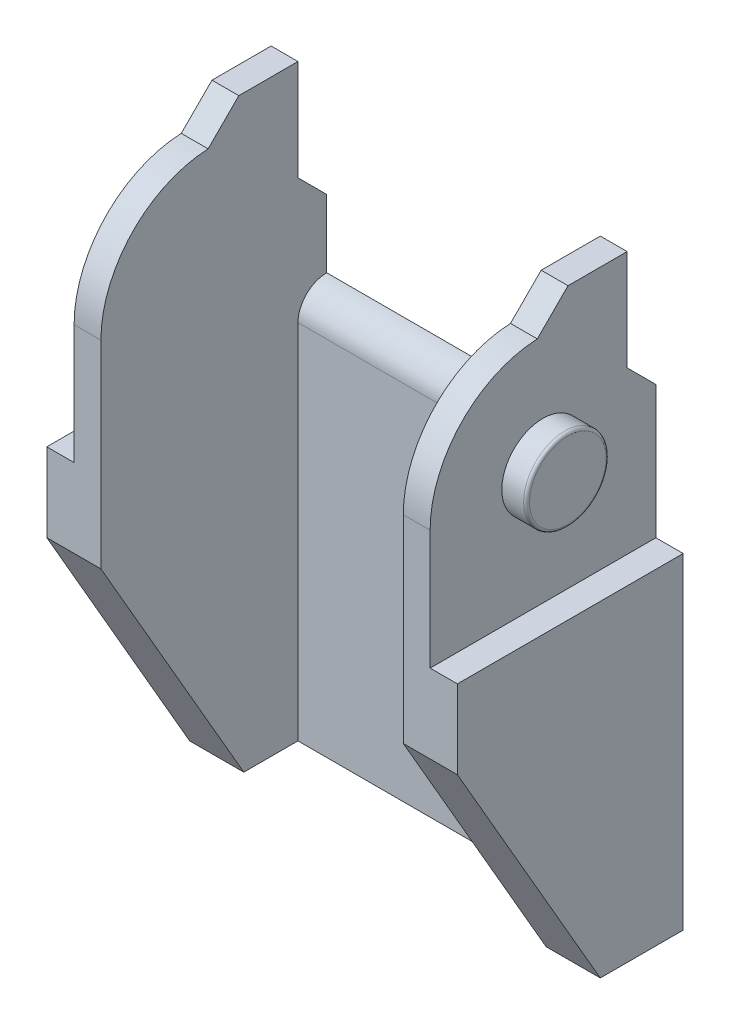
ISO-10303-21;
HEADER;
FILE_DESCRIPTION(('STEP AP214'),'2;1');
FILE_NAME('part.step','',(''),(''),'','','');
FILE_SCHEMA(('AUTOMOTIVE_DESIGN { 1 0 10303 214 1 1 1 1 }'));
ENDSEC;
DATA;
#1=APPLICATION_CONTEXT('core data for automotive mechanical design processes');
#2=APPLICATION_PROTOCOL_DEFINITION('international standard','automotive_design',2000,#1);
#3=PRODUCT_CONTEXT('',#1,'mechanical');
#4=PRODUCT('Part','Part','',(#3));
#5=PRODUCT_RELATED_PRODUCT_CATEGORY('part','',(#4));
#6=PRODUCT_DEFINITION_FORMATION('','',#4);
#7=PRODUCT_DEFINITION_CONTEXT('part definition',#1,'design');
#8=PRODUCT_DEFINITION('design','',#6,#7);
#9=PRODUCT_DEFINITION_SHAPE('','',#8);
#10=(LENGTH_UNIT() NAMED_UNIT(*) SI_UNIT(.MILLI.,.METRE.));
#11=(NAMED_UNIT(*) PLANE_ANGLE_UNIT() SI_UNIT($,.RADIAN.));
#12=(NAMED_UNIT(*) SI_UNIT($,.STERADIAN.) SOLID_ANGLE_UNIT());
#13=UNCERTAINTY_MEASURE_WITH_UNIT(LENGTH_MEASURE(1.E-05),#10,'distance_accuracy_value','');
#14=(GEOMETRIC_REPRESENTATION_CONTEXT(3) GLOBAL_UNCERTAINTY_ASSIGNED_CONTEXT((#13)) GLOBAL_UNIT_ASSIGNED_CONTEXT((#10,
#11,#12)) REPRESENTATION_CONTEXT('',''));
#15=CARTESIAN_POINT('',(0.,0.,0.));
#16=DIRECTION('',(0.,0.,1.));
#17=DIRECTION('',(1.,0.,0.));
#18=AXIS2_PLACEMENT_3D('',#15,#16,#17);
#19=CARTESIAN_POINT('',(10.25,2.1675,15.31));
#20=DIRECTION('',(0.,0.,-1.));
#21=DIRECTION('',(-1.,0.,0.));
#22=AXIS2_PLACEMENT_3D('',#19,#20,#21);
#23=PLANE('',#22);
#24=DIRECTION('',(-1.,0.,0.));
#25=VECTOR('',#24,1.);
#26=CARTESIAN_POINT('',(13.92,10.2629827702435,15.3100000000817));
#27=LINE('',#26,#25);
#28=CARTESIAN_POINT('',(12.07,10.2629827702435,15.3100000000817));
#29=VERTEX_POINT('',#28);
#30=CARTESIAN_POINT('',(10.25,10.2629827702435,15.3100000000817));
#31=VERTEX_POINT('',#30);
#32=EDGE_CURVE('E241',#29,#31,#27,.T.);
#33=ORIENTED_EDGE('',*,*,#32,.T.);
#34=DIRECTION('',(0.,-1.,0.));
#35=VECTOR('',#34,1.);
#36=CARTESIAN_POINT('',(10.25,10.2629827701714,15.31));
#37=LINE('',#36,#35);
#38=CARTESIAN_POINT('',(10.25,-3.1675,15.31));
#39=VERTEX_POINT('',#38);
#40=EDGE_CURVE('E316',#31,#39,#37,.T.);
#41=ORIENTED_EDGE('',*,*,#40,.T.);
#42=DIRECTION('',(-1.,0.,0.));
#43=VECTOR('',#42,1.);
#44=CARTESIAN_POINT('',(10.25,-3.1675,15.31));
#45=LINE('',#44,#43);
#46=CARTESIAN_POINT('',(13.92,-3.1675,15.31));
#47=VERTEX_POINT('',#46);
#48=EDGE_CURVE('E367',#47,#39,#45,.T.);
#49=ORIENTED_EDGE('',*,*,#48,.F.);
#50=DIRECTION('',(0.,-1.,0.));
#51=VECTOR('',#50,1.);
#52=CARTESIAN_POINT('',(13.92,2.1675,15.31));
#53=LINE('',#52,#51);
#54=CARTESIAN_POINT('',(13.92,2.1675,15.31));
#55=VERTEX_POINT('',#54);
#56=EDGE_CURVE('E353',#55,#47,#53,.T.);
#57=ORIENTED_EDGE('',*,*,#56,.F.);
#58=DIRECTION('',(1.,0.,0.));
#59=VECTOR('',#58,1.);
#60=CARTESIAN_POINT('',(12.07,2.1675,15.31));
#61=LINE('',#60,#59);
#62=CARTESIAN_POINT('',(12.07,2.1675,15.31));
#63=VERTEX_POINT('',#62);
#64=EDGE_CURVE('E268',#63,#55,#61,.T.);
#65=ORIENTED_EDGE('',*,*,#64,.F.);
#66=DIRECTION('',(0.,-1.,0.));
#67=VECTOR('',#66,1.);
#68=CARTESIAN_POINT('',(12.07,10.2629827701714,15.31));
#69=LINE('',#68,#67);
#70=EDGE_CURVE('E258',#29,#63,#69,.T.);
#71=ORIENTED_EDGE('',*,*,#70,.F.);
#72=EDGE_LOOP('',(#33,#41,#49,#57,#65,#71));
#73=FACE_BOUND('',#72,.T.);
#74=ADVANCED_FACE('F49',(#73),#23,.F.);
#75=CARTESIAN_POINT('',(10.25,-19.9474726521634,5.6220782759702));
#76=DIRECTION('',(0.,-0.499999999857117,0.866025403866932));
#77=DIRECTION('',(0.,-0.866025403866932,-0.499999999857117));
#78=AXIS2_PLACEMENT_3D('',#75,#76,#77);
#79=PLANE('',#78);
#80=DIRECTION('',(1.,0.,0.));
#81=VECTOR('',#80,1.);
#82=CARTESIAN_POINT('',(-13.92,-19.9475,5.62206248299805));
#83=LINE('',#82,#81);
#84=CARTESIAN_POINT('',(-13.92,-19.9475,5.62206248299805));
#85=VERTEX_POINT('',#84);
#86=CARTESIAN_POINT('',(-10.25,-19.9475,5.62206248484372));
#87=VERTEX_POINT('',#86);
#88=EDGE_CURVE('E350',#85,#87,#83,.T.);
#89=ORIENTED_EDGE('',*,*,#88,.T.);
#90=DIRECTION('',(0.,-0.866025403784439,-0.5));
#91=VECTOR('',#90,1.);
#92=CARTESIAN_POINT('',(-10.25,-3.1675,15.31));
#93=LINE('',#92,#91);
#94=CARTESIAN_POINT('',(-10.25,-3.1675,15.31));
#95=VERTEX_POINT('',#94);
#96=EDGE_CURVE('E322',#95,#87,#93,.T.);
#97=ORIENTED_EDGE('',*,*,#96,.F.);
#98=CARTESIAN_POINT('',(-13.92,-3.1675,15.31));
#99=VERTEX_POINT('',#98);
#100=EDGE_CURVE('E373',#95,#99,#45,.T.);
#101=ORIENTED_EDGE('',*,*,#100,.T.);
#102=DIRECTION('',(0.,0.866025403784438,0.500000000000001));
#103=VECTOR('',#102,1.);
#104=CARTESIAN_POINT('',(-13.92,-3.1675,15.31));
#105=LINE('',#104,#103);
#106=EDGE_CURVE('E347',#85,#99,#105,.T.);
#107=ORIENTED_EDGE('',*,*,#106,.F.);
#108=EDGE_LOOP('',(#89,#97,#101,#107));
#109=FACE_BOUND('',#108,.T.);
#110=ADVANCED_FACE('F939',(#109),#79,.T.);
#111=DIRECTION('',(0.,-1.,0.));
#112=VECTOR('',#111,1.);
#113=CARTESIAN_POINT('',(-10.25,19.9475,15.31));
#114=LINE('',#113,#112);
#115=CARTESIAN_POINT('',(-10.25,10.2629827701654,15.31));
#116=VERTEX_POINT('',#115);
#117=EDGE_CURVE('E319',#116,#95,#114,.T.);
#118=ORIENTED_EDGE('',*,*,#117,.F.);
#119=DIRECTION('',(1.,0.,0.));
#120=VECTOR('',#119,1.);
#121=CARTESIAN_POINT('',(-13.92,10.2629827701654,15.31));
#122=LINE('',#121,#120);
#123=CARTESIAN_POINT('',(-12.07,10.2629827701654,15.31));
#124=VERTEX_POINT('',#123);
#125=EDGE_CURVE('E289',#124,#116,#122,.T.);
#126=ORIENTED_EDGE('',*,*,#125,.F.);
#127=DIRECTION('',(0.,-1.,0.));
#128=VECTOR('',#127,1.);
#129=CARTESIAN_POINT('',(-12.07,19.9475,15.31));
#130=LINE('',#129,#128);
#131=CARTESIAN_POINT('',(-12.07,2.1675,15.31));
#132=VERTEX_POINT('',#131);
#133=EDGE_CURVE('E296',#124,#132,#130,.T.);
#134=ORIENTED_EDGE('',*,*,#133,.T.);
#135=DIRECTION('',(-1.,0.,0.));
#136=VECTOR('',#135,1.);
#137=CARTESIAN_POINT('',(-12.07,2.1675,15.31));
#138=LINE('',#137,#136);
#139=CARTESIAN_POINT('',(-13.92,2.1675,15.31));
#140=VERTEX_POINT('',#139);
#141=EDGE_CURVE('E298',#132,#140,#138,.T.);
#142=ORIENTED_EDGE('',*,*,#141,.T.);
#143=DIRECTION('',(0.,1.,0.));
#144=VECTOR('',#143,1.);
#145=CARTESIAN_POINT('',(-13.92,2.1675,15.31));
#146=LINE('',#145,#144);
#147=EDGE_CURVE('E339',#99,#140,#146,.T.);
#148=ORIENTED_EDGE('',*,*,#147,.F.);
#149=ORIENTED_EDGE('',*,*,#100,.F.);
#150=EDGE_LOOP('',(#118,#126,#134,#142,#148,#149));
#151=FACE_BOUND('',#150,.T.);
#152=ADVANCED_FACE('F930',(#151),#23,.F.);
#153=CARTESIAN_POINT('',(0.,19.9475,0.));
#154=DIRECTION('',(0.,-1.,0.));
#155=DIRECTION('',(0.,0.,-1.));
#156=AXIS2_PLACEMENT_3D('',#153,#154,#155);
#157=PLANE('',#156);
#158=DIRECTION('',(0.,0.,1.));
#159=VECTOR('',#158,1.);
#160=CARTESIAN_POINT('',(-10.25,19.9475,5.95980410209104));
#161=LINE('',#160,#159);
#162=CARTESIAN_POINT('',(-10.25,19.9475,1.95));
#163=VERTEX_POINT('',#162);
#164=CARTESIAN_POINT('',(-10.25,19.9474999999203,5.95980410201135));
#165=VERTEX_POINT('',#164);
#166=EDGE_CURVE('E317',#163,#165,#161,.T.);
#167=ORIENTED_EDGE('',*,*,#166,.F.);
#168=DIRECTION('',(1.,0.,0.));
#169=VECTOR('',#168,1.);
#170=CARTESIAN_POINT('',(-13.92,19.9475,1.95));
#171=LINE('',#170,#169);
#172=CARTESIAN_POINT('',(-12.07,19.9475,1.95));
#173=VERTEX_POINT('',#172);
#174=EDGE_CURVE('E223',#173,#163,#171,.T.);
#175=ORIENTED_EDGE('',*,*,#174,.F.);
#176=DIRECTION('',(0.,0.,-1.));
#177=VECTOR('',#176,1.);
#178=CARTESIAN_POINT('',(-12.07,19.9475,15.31));
#179=LINE('',#178,#177);
#180=CARTESIAN_POINT('',(-12.07,19.9475,5.95980410193166));
#181=VERTEX_POINT('',#180);
#182=EDGE_CURVE('E302',#181,#173,#179,.T.);
#183=ORIENTED_EDGE('',*,*,#182,.F.);
#184=DIRECTION('',(1.,0.,0.));
#185=VECTOR('',#184,1.);
#186=CARTESIAN_POINT('',(-13.92,19.9474999999203,5.95980410201135));
#187=LINE('',#186,#185);
#188=EDGE_CURVE('E292',#181,#165,#187,.T.);
#189=ORIENTED_EDGE('',*,*,#188,.T.);
#190=EDGE_LOOP('',(#167,#175,#183,#189));
#191=FACE_BOUND('',#190,.T.);
#192=ADVANCED_FACE('F914',(#191),#157,.F.);
#193=CARTESIAN_POINT('',(0.,0.,0.));
#194=DIRECTION('',(0.,0.,1.));
#195=DIRECTION('',(1.,0.,0.));
#196=AXIS2_PLACEMENT_3D('',#193,#194,#195);
#197=PLANE('',#196);
#198=CARTESIAN_POINT('',(0.,-12.9475,0.));
#199=DIRECTION('',(0.,0.,-1.));
#200=DIRECTION('',(-1.,0.,0.));
#201=AXIS2_PLACEMENT_3D('',#198,#199,#200);
#202=CIRCLE('',#201,1.7);
#203=CARTESIAN_POINT('',(-1.7,-12.9475,0.));
#204=VERTEX_POINT('',#203);
#205=EDGE_CURVE('E895',#204,#204,#202,.T.);
#206=ORIENTED_EDGE('',*,*,#205,.F.);
#207=EDGE_LOOP('',(#206));
#208=FACE_BOUND('',#207,.T.);
#209=CARTESIAN_POINT('',(0.,-3.9475,0.));
#210=DIRECTION('',(0.,0.,-1.));
#211=DIRECTION('',(-1.,0.,0.));
#212=AXIS2_PLACEMENT_3D('',#209,#210,#211);
#213=CIRCLE('',#212,1.7);
#214=CARTESIAN_POINT('',(-1.7,-3.9475,0.));
#215=VERTEX_POINT('',#214);
#216=EDGE_CURVE('E900',#215,#215,#213,.T.);
#217=ORIENTED_EDGE('',*,*,#216,.F.);
#218=EDGE_LOOP('',(#217));
#219=FACE_BOUND('',#218,.T.);
#220=DIRECTION('',(0.,-1.,0.));
#221=VECTOR('',#220,1.);
#222=CARTESIAN_POINT('',(-12.07,11.1675,0.));
#223=LINE('',#222,#221);
#224=CARTESIAN_POINT('',(-12.07,11.1675,0.));
#225=VERTEX_POINT('',#224);
#226=CARTESIAN_POINT('',(-12.07,2.1675,0.));
#227=VERTEX_POINT('',#226);
#228=EDGE_CURVE('E291',#225,#227,#223,.T.);
#229=ORIENTED_EDGE('',*,*,#228,.F.);
#230=DIRECTION('',(1.,0.,0.));
#231=VECTOR('',#230,1.);
#232=CARTESIAN_POINT('',(-13.92,11.1675,0.));
#233=LINE('',#232,#231);
#234=CARTESIAN_POINT('',(-10.25,11.1675,0.));
#235=VERTEX_POINT('',#234);
#236=EDGE_CURVE('E66',#225,#235,#233,.T.);
#237=ORIENTED_EDGE('',*,*,#236,.T.);
#238=DIRECTION('',(0.,1.,0.));
#239=VECTOR('',#238,1.);
#240=CARTESIAN_POINT('',(-10.25,6.56727770770958,-2.16703878204331E-08));
#241=LINE('',#240,#239);
#242=CARTESIAN_POINT('',(-10.25,6.56727770770958,-2.16703879398362E-08));
#243=VERTEX_POINT('',#242);
#244=EDGE_CURVE('E231',#243,#235,#241,.T.);
#245=ORIENTED_EDGE('',*,*,#244,.F.);
#246=DIRECTION('',(1.,0.,0.));
#247=VECTOR('',#246,1.);
#248=CARTESIAN_POINT('',(-10.25,6.56727770770958,-2.16703879398362E-08));
#249=LINE('',#248,#247);
#250=CARTESIAN_POINT('',(10.25,6.56727770770958,-2.16703879398362E-08));
#251=VERTEX_POINT('',#250);
#252=EDGE_CURVE('E336',#243,#251,#249,.T.);
#253=ORIENTED_EDGE('',*,*,#252,.T.);
#254=DIRECTION('',(0.,1.,0.));
#255=VECTOR('',#254,1.);
#256=CARTESIAN_POINT('',(10.25,11.1672777077096,-2.16703878204331E-08));
#257=LINE('',#256,#255);
#258=CARTESIAN_POINT('',(10.25,11.1675,0.));
#259=VERTEX_POINT('',#258);
#260=EDGE_CURVE('E320',#251,#259,#257,.T.);
#261=ORIENTED_EDGE('',*,*,#260,.T.);
#262=DIRECTION('',(1.,0.,0.));
#263=VECTOR('',#262,1.);
#264=CARTESIAN_POINT('',(-13.921,11.1675,0.));
#265=LINE('',#264,#263);
#266=CARTESIAN_POINT('',(12.07,11.1675,0.));
#267=VERTEX_POINT('',#266);
#268=EDGE_CURVE('E256',#259,#267,#265,.T.);
#269=ORIENTED_EDGE('',*,*,#268,.T.);
#270=DIRECTION('',(0.,-1.,0.));
#271=VECTOR('',#270,1.);
#272=CARTESIAN_POINT('',(12.07,19.9475,-2.16703877065072E-08));
#273=LINE('',#272,#271);
#274=CARTESIAN_POINT('',(12.07,2.1675,-2.16703877065072E-08));
#275=VERTEX_POINT('',#274);
#276=EDGE_CURVE('E265',#267,#275,#273,.T.);
#277=ORIENTED_EDGE('',*,*,#276,.T.);
#278=DIRECTION('',(1.,0.,0.));
#279=VECTOR('',#278,1.);
#280=CARTESIAN_POINT('',(12.07,2.1675,-2.16703877065072E-08));
#281=LINE('',#280,#279);
#282=CARTESIAN_POINT('',(13.92,2.1675,-2.16703877065072E-08));
#283=VERTEX_POINT('',#282);
#284=EDGE_CURVE('E267',#275,#283,#281,.T.);
#285=ORIENTED_EDGE('',*,*,#284,.T.);
#286=DIRECTION('',(0.,1.,0.));
#287=VECTOR('',#286,1.);
#288=CARTESIAN_POINT('',(13.92,2.1675,0.));
#289=LINE('',#288,#287);
#290=CARTESIAN_POINT('',(13.92,-19.9475,0.));
#291=VERTEX_POINT('',#290);
#292=EDGE_CURVE('E360',#291,#283,#289,.T.);
#293=ORIENTED_EDGE('',*,*,#292,.F.);
#294=DIRECTION('',(-1.,0.,0.));
#295=VECTOR('',#294,1.);
#296=CARTESIAN_POINT('',(-10.25,-19.9475,0.));
#297=LINE('',#296,#295);
#298=CARTESIAN_POINT('',(-13.92,-19.9475,0.));
#299=VERTEX_POINT('',#298);
#300=EDGE_CURVE('E366',#291,#299,#297,.T.);
#301=ORIENTED_EDGE('',*,*,#300,.T.);
#302=DIRECTION('',(0.,-1.,0.));
#303=VECTOR('',#302,1.);
#304=CARTESIAN_POINT('',(-13.92,2.1675,0.));
#305=LINE('',#304,#303);
#306=CARTESIAN_POINT('',(-13.92,2.1675,0.));
#307=VERTEX_POINT('',#306);
#308=EDGE_CURVE('E343',#307,#299,#305,.T.);
#309=ORIENTED_EDGE('',*,*,#308,.F.);
#310=DIRECTION('',(-1.,0.,0.));
#311=VECTOR('',#310,1.);
#312=CARTESIAN_POINT('',(-12.07,2.1675,0.));
#313=LINE('',#312,#311);
#314=EDGE_CURVE('E299',#227,#307,#313,.T.);
#315=ORIENTED_EDGE('',*,*,#314,.F.);
#316=EDGE_LOOP('',(#229,#237,#245,#253,#261,#269,#277,#285,#293,#301,#309,#315));
#317=FACE_BOUND('',#316,.T.);
#318=ADVANCED_FACE('F910',(#208,#219,#317),#197,.F.);
#319=DIRECTION('',(0.,-0.866025403784439,-0.5));
#320=VECTOR('',#319,1.);
#321=CARTESIAN_POINT('',(10.25,-3.1675,15.31));
#322=LINE('',#321,#320);
#323=CARTESIAN_POINT('',(10.25,-19.9475,5.62206248484372));
#324=VERTEX_POINT('',#323);
#325=EDGE_CURVE('E329',#39,#324,#322,.T.);
#326=ORIENTED_EDGE('',*,*,#325,.T.);
#327=DIRECTION('',(-1.,0.,0.));
#328=VECTOR('',#327,1.);
#329=CARTESIAN_POINT('',(13.92,-19.9475,5.62206248299805));
#330=LINE('',#329,#328);
#331=CARTESIAN_POINT('',(13.92,-19.9475,5.62206248299805));
#332=VERTEX_POINT('',#331);
#333=EDGE_CURVE('E363',#332,#324,#330,.T.);
#334=ORIENTED_EDGE('',*,*,#333,.F.);
#335=DIRECTION('',(0.,-0.866025403784438,-0.500000000000001));
#336=VECTOR('',#335,1.);
#337=CARTESIAN_POINT('',(13.92,-19.9475,5.62206248299805));
#338=LINE('',#337,#336);
#339=EDGE_CURVE('E355',#47,#332,#338,.T.);
#340=ORIENTED_EDGE('',*,*,#339,.F.);
#341=ORIENTED_EDGE('',*,*,#48,.T.);
#342=EDGE_LOOP('',(#326,#334,#340,#341));
#343=FACE_BOUND('',#342,.T.);
#344=ADVANCED_FACE('F913',(#343),#79,.T.);
#345=CARTESIAN_POINT('',(-10.25,-19.9475,0.));
#346=DIRECTION('',(0.,1.,0.));
#347=DIRECTION('',(0.,0.,1.));
#348=AXIS2_PLACEMENT_3D('',#345,#346,#347);
#349=PLANE('',#348);
#350=DIRECTION('',(1.,0.,0.));
#351=VECTOR('',#350,1.);
#352=CARTESIAN_POINT('',(-10.25,-19.9475,1.94999997832964));
#353=LINE('',#352,#351);
#354=CARTESIAN_POINT('',(-10.25,-19.9475,1.94999997832964));
#355=VERTEX_POINT('',#354);
#356=CARTESIAN_POINT('',(10.25,-19.9475,1.94999997832964));
#357=VERTEX_POINT('',#356);
#358=EDGE_CURVE('E372',#355,#357,#353,.T.);
#359=ORIENTED_EDGE('',*,*,#358,.F.);
#360=DIRECTION('',(0.,0.,-1.));
#361=VECTOR('',#360,1.);
#362=CARTESIAN_POINT('',(-10.25,-19.9475,0.));
#363=LINE('',#362,#361);
#364=EDGE_CURVE('E859',#87,#355,#363,.T.);
#365=ORIENTED_EDGE('',*,*,#364,.F.);
#366=ORIENTED_EDGE('',*,*,#88,.F.);
#367=DIRECTION('',(0.,0.,1.));
#368=VECTOR('',#367,1.);
#369=CARTESIAN_POINT('',(-13.92,-19.9475,5.62206248299805));
#370=LINE('',#369,#368);
#371=EDGE_CURVE('E345',#299,#85,#370,.T.);
#372=ORIENTED_EDGE('',*,*,#371,.F.);
#373=ORIENTED_EDGE('',*,*,#300,.F.);
#374=DIRECTION('',(0.,0.,-1.));
#375=VECTOR('',#374,1.);
#376=CARTESIAN_POINT('',(13.92,-19.9475,0.));
#377=LINE('',#376,#375);
#378=EDGE_CURVE('E357',#332,#291,#377,.T.);
#379=ORIENTED_EDGE('',*,*,#378,.F.);
#380=ORIENTED_EDGE('',*,*,#333,.T.);
#381=DIRECTION('',(0.,0.,1.));
#382=VECTOR('',#381,1.);
#383=CARTESIAN_POINT('',(10.25,-19.9475,0.));
#384=LINE('',#383,#382);
#385=EDGE_CURVE('E855',#324,#357,#384,.F.);
#386=ORIENTED_EDGE('',*,*,#385,.T.);
#387=EDGE_LOOP('',(#359,#365,#366,#372,#373,#379,#380,#386));
#388=FACE_BOUND('',#387,.T.);
#389=ADVANCED_FACE('F1010',(#388),#349,.F.);
#390=CARTESIAN_POINT('',(13.92,0.,0.));
#391=DIRECTION('',(-1.,0.,0.));
#392=DIRECTION('',(0.,0.,1.));
#393=AXIS2_PLACEMENT_3D('',#390,#391,#392);
#394=PLANE('',#393);
#395=ORIENTED_EDGE('',*,*,#292,.T.);
#396=DIRECTION('',(0.,0.,1.));
#397=VECTOR('',#396,1.);
#398=CARTESIAN_POINT('',(13.92,2.1675,-2.16703877065072E-08));
#399=LINE('',#398,#397);
#400=EDGE_CURVE('E274',#283,#55,#399,.T.);
#401=ORIENTED_EDGE('',*,*,#400,.T.);
#402=ORIENTED_EDGE('',*,*,#56,.T.);
#403=ORIENTED_EDGE('',*,*,#339,.T.);
#404=ORIENTED_EDGE('',*,*,#378,.T.);
#405=EDGE_LOOP('',(#395,#401,#402,#403,#404));
#406=FACE_BOUND('',#405,.T.);
#407=ADVANCED_FACE('F1005',(#406),#394,.F.);
#408=CARTESIAN_POINT('',(-13.92,0.,0.));
#409=DIRECTION('',(1.,0.,0.));
#410=DIRECTION('',(0.,0.,-1.));
#411=AXIS2_PLACEMENT_3D('',#408,#409,#410);
#412=PLANE('',#411);
#413=ORIENTED_EDGE('',*,*,#147,.T.);
#414=DIRECTION('',(0.,0.,-1.));
#415=VECTOR('',#414,1.);
#416=CARTESIAN_POINT('',(-13.92,2.1675,15.31));
#417=LINE('',#416,#415);
#418=EDGE_CURVE('E305',#140,#307,#417,.T.);
#419=ORIENTED_EDGE('',*,*,#418,.T.);
#420=ORIENTED_EDGE('',*,*,#308,.T.);
#421=ORIENTED_EDGE('',*,*,#371,.T.);
#422=ORIENTED_EDGE('',*,*,#106,.T.);
#423=EDGE_LOOP('',(#413,#419,#420,#421,#422));
#424=FACE_BOUND('',#423,.T.);
#425=ADVANCED_FACE('F934',(#424),#412,.F.);
#426=CARTESIAN_POINT('',(10.25,4.61727770770956,-2.16703878204331E-08));
#427=DIRECTION('',(1.,0.,0.));
#428=DIRECTION('',(0.,0.,-1.));
#429=AXIS2_PLACEMENT_3D('',#426,#427,#428);
#430=PLANE('',#429);
#431=ORIENTED_EDGE('',*,*,#40,.F.);
#432=CARTESIAN_POINT('',(10.25,10.2629827702435,7.70105335394365));
#433=DIRECTION('',(1.,0.,0.));
#434=DIRECTION('',(0.,0.,-1.));
#435=AXIS2_PLACEMENT_3D('',#432,#433,#434);
#436=CIRCLE('',#435,7.60894664613806);
#437=CARTESIAN_POINT('',(10.25,17.8642390521744,8.04306504991668));
#438=VERTEX_POINT('',#437);
#439=EDGE_CURVE('E236',#438,#31,#436,.T.);
#440=ORIENTED_EDGE('',*,*,#439,.F.);
#441=DIRECTION('',(0.,-0.707106781186542,0.707106781186553));
#442=VECTOR('',#441,1.);
#443=CARTESIAN_POINT('',(10.25,19.9475,5.95980410209104));
#444=LINE('',#443,#442);
#445=CARTESIAN_POINT('',(10.25,19.9475,5.95980410209104));
#446=VERTEX_POINT('',#445);
#447=EDGE_CURVE('E239',#446,#438,#444,.T.);
#448=ORIENTED_EDGE('',*,*,#447,.F.);
#449=DIRECTION('',(0.,0.,1.));
#450=VECTOR('',#449,1.);
#451=CARTESIAN_POINT('',(10.25,19.9475,1.95));
#452=LINE('',#451,#450);
#453=CARTESIAN_POINT('',(10.25,19.9475,1.95));
#454=VERTEX_POINT('',#453);
#455=EDGE_CURVE('E308',#454,#446,#452,.T.);
#456=ORIENTED_EDGE('',*,*,#455,.F.);
#457=DIRECTION('',(0.,1.,0.));
#458=VECTOR('',#457,1.);
#459=CARTESIAN_POINT('',(10.25,19.9475,1.95));
#460=LINE('',#459,#458);
#461=CARTESIAN_POINT('',(10.25,13.1175,1.95));
#462=VERTEX_POINT('',#461);
#463=EDGE_CURVE('E251',#462,#454,#460,.T.);
#464=ORIENTED_EDGE('',*,*,#463,.F.);
#465=DIRECTION('',(0.,0.707106781186546,0.707106781186549));
#466=VECTOR('',#465,1.);
#467=CARTESIAN_POINT('',(10.25,13.1175,1.95));
#468=LINE('',#467,#466);
#469=EDGE_CURVE('E248',#259,#462,#468,.T.);
#470=ORIENTED_EDGE('',*,*,#469,.F.);
#471=ORIENTED_EDGE('',*,*,#260,.F.);
#472=CARTESIAN_POINT('',(10.25,4.61727770770956,-2.16703878204331E-08));
#473=DIRECTION('',(-1.,0.,0.));
#474=DIRECTION('',(0.,0.,-1.));
#475=AXIS2_PLACEMENT_3D('',#472,#473,#474);
#476=CIRCLE('',#475,1.95000000000002);
#477=CARTESIAN_POINT('',(10.25,4.61727770770956,1.94999997832963));
#478=VERTEX_POINT('',#477);
#479=EDGE_CURVE('E330',#478,#251,#476,.T.);
#480=ORIENTED_EDGE('',*,*,#479,.F.);
#481=DIRECTION('',(0.,1.,0.));
#482=VECTOR('',#481,1.);
#483=CARTESIAN_POINT('',(10.25,-19.947472650565,1.94999997832964));
#484=LINE('',#483,#482);
#485=EDGE_CURVE('E333',#357,#478,#484,.T.);
#486=ORIENTED_EDGE('',*,*,#485,.F.);
#487=ORIENTED_EDGE('',*,*,#385,.F.);
#488=ORIENTED_EDGE('',*,*,#325,.F.);
#489=EDGE_LOOP('',(#431,#440,#448,#456,#464,#470,#471,#480,#486,#487,#488));
#490=FACE_BOUND('',#489,.T.);
#491=ADVANCED_FACE('F1065',(#490),#430,.F.);
#492=CARTESIAN_POINT('',(-10.25,4.61727770770956,-2.16703878204331E-08));
#493=DIRECTION('',(1.,0.,0.));
#494=DIRECTION('',(0.,0.,-1.));
#495=AXIS2_PLACEMENT_3D('',#492,#493,#494);
#496=CYLINDRICAL_SURFACE('',#495,1.95000000000002);
#497=ORIENTED_EDGE('',*,*,#479,.T.);
#498=ORIENTED_EDGE('',*,*,#252,.F.);
#499=CARTESIAN_POINT('',(-10.25,4.61727770770956,-2.16703878204331E-08));
#500=DIRECTION('',(-1.,0.,0.));
#501=DIRECTION('',(0.,0.,-1.));
#502=AXIS2_PLACEMENT_3D('',#499,#500,#501);
#503=CIRCLE('',#502,1.95000000000002);
#504=CARTESIAN_POINT('',(-10.25,4.61727770770956,1.94999997832963));
#505=VERTEX_POINT('',#504);
#506=EDGE_CURVE('E323',#505,#243,#503,.T.);
#507=ORIENTED_EDGE('',*,*,#506,.F.);
#508=DIRECTION('',(1.,0.,0.));
#509=VECTOR('',#508,1.);
#510=CARTESIAN_POINT('',(-10.25,4.61727770770956,1.94999997832963));
#511=LINE('',#510,#509);
#512=EDGE_CURVE('E327',#505,#478,#511,.T.);
#513=ORIENTED_EDGE('',*,*,#512,.T.);
#514=EDGE_LOOP('',(#497,#498,#507,#513));
#515=FACE_BOUND('',#514,.T.);
#516=ADVANCED_FACE('F1070',(#515),#496,.T.);
#517=CARTESIAN_POINT('',(-10.25,-19.947472650565,1.94999997832964));
#518=DIRECTION('',(0.,0.,-1.));
#519=DIRECTION('',(0.,1.,0.));
#520=AXIS2_PLACEMENT_3D('',#517,#518,#519);
#521=PLANE('',#520);
#522=CARTESIAN_POINT('',(0.,-12.9475,1.94999997832964));
#523=DIRECTION('',(0.,0.,-1.));
#524=DIRECTION('',(0.,1.,0.));
#525=AXIS2_PLACEMENT_3D('',#522,#523,#524);
#526=CIRCLE('',#525,1.7);
#527=CARTESIAN_POINT('',(0.,-11.2475,1.94999997832964));
#528=VERTEX_POINT('',#527);
#529=EDGE_CURVE('E53',#528,#528,#526,.T.);
#530=ORIENTED_EDGE('',*,*,#529,.T.);
#531=EDGE_LOOP('',(#530));
#532=FACE_BOUND('',#531,.T.);
#533=CARTESIAN_POINT('',(0.,-3.9475,1.94999997832964));
#534=DIRECTION('',(0.,0.,-1.));
#535=DIRECTION('',(0.,1.,0.));
#536=AXIS2_PLACEMENT_3D('',#533,#534,#535);
#537=CIRCLE('',#536,1.7);
#538=CARTESIAN_POINT('',(0.,-2.2475,1.94999997832964));
#539=VERTEX_POINT('',#538);
#540=EDGE_CURVE('E893',#539,#539,#537,.T.);
#541=ORIENTED_EDGE('',*,*,#540,.T.);
#542=EDGE_LOOP('',(#541));
#543=FACE_BOUND('',#542,.T.);
#544=ORIENTED_EDGE('',*,*,#485,.T.);
#545=ORIENTED_EDGE('',*,*,#512,.F.);
#546=DIRECTION('',(0.,1.,0.));
#547=VECTOR('',#546,1.);
#548=CARTESIAN_POINT('',(-10.25,-19.947472650565,1.94999997832964));
#549=LINE('',#548,#547);
#550=EDGE_CURVE('E325',#355,#505,#549,.T.);
#551=ORIENTED_EDGE('',*,*,#550,.F.);
#552=ORIENTED_EDGE('',*,*,#358,.T.);
#553=EDGE_LOOP('',(#544,#545,#551,#552));
#554=FACE_BOUND('',#553,.T.);
#555=ADVANCED_FACE('F1120',(#532,#543,#554),#521,.F.);
#556=CARTESIAN_POINT('',(-10.25,4.61727770770956,-2.16703878204331E-08));
#557=DIRECTION('',(1.,0.,0.));
#558=DIRECTION('',(0.,0.,-1.));
#559=AXIS2_PLACEMENT_3D('',#556,#557,#558);
#560=PLANE('',#559);
#561=DIRECTION('',(0.,-1.,0.));
#562=VECTOR('',#561,1.);
#563=CARTESIAN_POINT('',(-10.25,19.9475,1.95));
#564=LINE('',#563,#562);
#565=CARTESIAN_POINT('',(-10.25,13.1175,1.95));
#566=VERTEX_POINT('',#565);
#567=EDGE_CURVE('E220',#163,#566,#564,.T.);
#568=ORIENTED_EDGE('',*,*,#567,.F.);
#569=ORIENTED_EDGE('',*,*,#166,.T.);
#570=DIRECTION('',(0.,0.707106781186547,-0.707106781186548));
#571=VECTOR('',#570,1.);
#572=CARTESIAN_POINT('',(-10.25,17.864239052018,8.04306504991366));
#573=LINE('',#572,#571);
#574=CARTESIAN_POINT('',(-10.25,17.864239052018,8.04306504991366));
#575=VERTEX_POINT('',#574);
#576=EDGE_CURVE('E285',#575,#165,#573,.T.);
#577=ORIENTED_EDGE('',*,*,#576,.F.);
#578=CARTESIAN_POINT('',(-10.25,10.2629827701654,7.70105335394014));
#579=DIRECTION('',(-1.,0.,0.));
#580=DIRECTION('',(0.,0.,-1.));
#581=AXIS2_PLACEMENT_3D('',#578,#579,#580);
#582=CIRCLE('',#581,7.60894664605986);
#583=EDGE_CURVE('E277',#116,#575,#582,.T.);
#584=ORIENTED_EDGE('',*,*,#583,.F.);
#585=ORIENTED_EDGE('',*,*,#117,.T.);
#586=ORIENTED_EDGE('',*,*,#96,.T.);
#587=ORIENTED_EDGE('',*,*,#364,.T.);
#588=ORIENTED_EDGE('',*,*,#550,.T.);
#589=ORIENTED_EDGE('',*,*,#506,.T.);
#590=ORIENTED_EDGE('',*,*,#244,.T.);
#591=DIRECTION('',(0.,-0.707106781186546,-0.707106781186548));
#592=VECTOR('',#591,1.);
#593=CARTESIAN_POINT('',(-10.25,13.1175,1.95));
#594=LINE('',#593,#592);
#595=EDGE_CURVE('E214',#566,#235,#594,.T.);
#596=ORIENTED_EDGE('',*,*,#595,.F.);
#597=EDGE_LOOP('',(#568,#569,#577,#584,#585,#586,#587,#588,#589,#590,#596));
#598=FACE_BOUND('',#597,.T.);
#599=ADVANCED_FACE('F228',(#598),#560,.T.);
#600=CARTESIAN_POINT('',(0.,19.9475,0.));
#601=DIRECTION('',(0.,-1.,0.));
#602=DIRECTION('',(0.,0.,-1.));
#603=AXIS2_PLACEMENT_3D('',#600,#601,#602);
#604=PLANE('',#603);
#605=ORIENTED_EDGE('',*,*,#455,.T.);
#606=DIRECTION('',(-1.,0.,0.));
#607=VECTOR('',#606,1.);
#608=CARTESIAN_POINT('',(13.92,19.9475,5.95980410209104));
#609=LINE('',#608,#607);
#610=CARTESIAN_POINT('',(12.07,19.9475,5.95980410209104));
#611=VERTEX_POINT('',#610);
#612=EDGE_CURVE('E244',#611,#446,#609,.T.);
#613=ORIENTED_EDGE('',*,*,#612,.F.);
#614=DIRECTION('',(0.,0.,1.));
#615=VECTOR('',#614,1.);
#616=CARTESIAN_POINT('',(12.07,19.9475,-2.16703877065072E-08));
#617=LINE('',#616,#615);
#618=CARTESIAN_POINT('',(12.07,19.9475,1.95));
#619=VERTEX_POINT('',#618);
#620=EDGE_CURVE('E271',#619,#611,#617,.T.);
#621=ORIENTED_EDGE('',*,*,#620,.F.);
#622=DIRECTION('',(1.,0.,0.));
#623=VECTOR('',#622,1.);
#624=CARTESIAN_POINT('',(-13.921,19.9475,1.95));
#625=LINE('',#624,#623);
#626=EDGE_CURVE('E259',#454,#619,#625,.T.);
#627=ORIENTED_EDGE('',*,*,#626,.F.);
#628=EDGE_LOOP('',(#605,#613,#621,#627));
#629=FACE_BOUND('',#628,.T.);
#630=ADVANCED_FACE('F1079',(#629),#604,.F.);
#631=CARTESIAN_POINT('',(-12.07,2.1675,15.31));
#632=DIRECTION('',(0.,-1.,0.));
#633=DIRECTION('',(0.,0.,-1.));
#634=AXIS2_PLACEMENT_3D('',#631,#632,#633);
#635=PLANE('',#634);
#636=ORIENTED_EDGE('',*,*,#314,.T.);
#637=ORIENTED_EDGE('',*,*,#418,.F.);
#638=ORIENTED_EDGE('',*,*,#141,.F.);
#639=DIRECTION('',(0.,0.,-1.));
#640=VECTOR('',#639,1.);
#641=CARTESIAN_POINT('',(-12.07,2.1675,15.31));
#642=LINE('',#641,#640);
#643=EDGE_CURVE('E309',#132,#227,#642,.T.);
#644=ORIENTED_EDGE('',*,*,#643,.T.);
#645=EDGE_LOOP('',(#636,#637,#638,#644));
#646=FACE_BOUND('',#645,.T.);
#647=ADVANCED_FACE('F926',(#646),#635,.F.);
#648=CARTESIAN_POINT('',(-12.07,11.1675,15.31));
#649=DIRECTION('',(1.,0.,0.));
#650=DIRECTION('',(0.,0.,-1.));
#651=AXIS2_PLACEMENT_3D('',#648,#649,#650);
#652=PLANE('',#651);
#653=CARTESIAN_POINT('',(-12.07,10.2125,7.655));
#654=DIRECTION('',(1.,0.,0.));
#655=DIRECTION('',(0.,0.,-1.));
#656=AXIS2_PLACEMENT_3D('',#653,#654,#655);
#657=CIRCLE('',#656,2.795);
#658=CARTESIAN_POINT('',(-12.07,10.2125,4.86));
#659=VERTEX_POINT('',#658);
#660=EDGE_CURVE('E880',#659,#659,#657,.F.);
#661=ORIENTED_EDGE('',*,*,#660,.F.);
#662=EDGE_LOOP('',(#661));
#663=FACE_BOUND('',#662,.T.);
#664=ORIENTED_EDGE('',*,*,#182,.T.);
#665=DIRECTION('',(0.,-1.,0.));
#666=VECTOR('',#665,1.);
#667=CARTESIAN_POINT('',(-12.07,11.1675,1.95));
#668=LINE('',#667,#666);
#669=CARTESIAN_POINT('',(-12.07,13.1175,1.95));
#670=VERTEX_POINT('',#669);
#671=EDGE_CURVE('E878',#173,#670,#668,.T.);
#672=ORIENTED_EDGE('',*,*,#671,.T.);
#673=DIRECTION('',(0.,-0.707106781186547,-0.707106781186549));
#674=VECTOR('',#673,1.);
#675=CARTESIAN_POINT('',(-12.07,18.8225,7.65500000000002));
#676=LINE('',#675,#674);
#677=EDGE_CURVE('E215',#670,#225,#676,.T.);
#678=ORIENTED_EDGE('',*,*,#677,.T.);
#679=ORIENTED_EDGE('',*,*,#228,.T.);
#680=ORIENTED_EDGE('',*,*,#643,.F.);
#681=ORIENTED_EDGE('',*,*,#133,.F.);
#682=CARTESIAN_POINT('',(-12.07,10.2629827701654,7.70105335394014));
#683=DIRECTION('',(1.,0.,0.));
#684=DIRECTION('',(0.,0.,-1.));
#685=AXIS2_PLACEMENT_3D('',#682,#683,#684);
#686=CIRCLE('',#685,7.60894664605986);
#687=CARTESIAN_POINT('',(-12.07,17.864239052018,8.04306504991366));
#688=VERTEX_POINT('',#687);
#689=EDGE_CURVE('E868',#124,#688,#686,.F.);
#690=ORIENTED_EDGE('',*,*,#689,.T.);
#691=DIRECTION('',(0.,0.707106781186547,-0.707106781186548));
#692=VECTOR('',#691,1.);
#693=CARTESIAN_POINT('',(-12.07,10.8824020509658,15.0249020509658));
#694=LINE('',#693,#692);
#695=EDGE_CURVE('E863',#688,#181,#694,.T.);
#696=ORIENTED_EDGE('',*,*,#695,.T.);
#697=EDGE_LOOP('',(#664,#672,#678,#679,#680,#681,#690,#696));
#698=FACE_BOUND('',#697,.T.);
#699=ADVANCED_FACE('F922',(#663,#698),#652,.F.);
#700=CARTESIAN_POINT('',(-13.92,10.2629827701654,7.70105335394014));
#701=DIRECTION('',(1.,0.,0.));
#702=DIRECTION('',(0.,0.,-1.));
#703=AXIS2_PLACEMENT_3D('',#700,#701,#702);
#704=CYLINDRICAL_SURFACE('',#703,7.60894664605986);
#705=ORIENTED_EDGE('',*,*,#125,.T.);
#706=ORIENTED_EDGE('',*,*,#583,.T.);
#707=DIRECTION('',(1.,0.,0.));
#708=VECTOR('',#707,1.);
#709=CARTESIAN_POINT('',(-13.92,17.864239052018,8.04306504991366));
#710=LINE('',#709,#708);
#711=EDGE_CURVE('E288',#688,#575,#710,.T.);
#712=ORIENTED_EDGE('',*,*,#711,.F.);
#713=ORIENTED_EDGE('',*,*,#689,.F.);
#714=EDGE_LOOP('',(#705,#706,#712,#713));
#715=FACE_BOUND('',#714,.T.);
#716=ADVANCED_FACE('F980',(#715),#704,.T.);
#717=CARTESIAN_POINT('',(-13.92,17.864239052018,8.04306504991366));
#718=DIRECTION('',(0.,-0.707106781186548,-0.707106781186547));
#719=DIRECTION('',(0.,0.707106781186547,-0.707106781186548));
#720=AXIS2_PLACEMENT_3D('',#717,#718,#719);
#721=PLANE('',#720);
#722=ORIENTED_EDGE('',*,*,#711,.T.);
#723=ORIENTED_EDGE('',*,*,#576,.T.);
#724=ORIENTED_EDGE('',*,*,#188,.F.);
#725=ORIENTED_EDGE('',*,*,#695,.F.);
#726=EDGE_LOOP('',(#722,#723,#724,#725));
#727=FACE_BOUND('',#726,.T.);
#728=ADVANCED_FACE('F985',(#727),#721,.F.);
#729=CARTESIAN_POINT('',(12.07,2.1675,-2.16703877065072E-08));
#730=DIRECTION('',(0.,-1.,0.));
#731=DIRECTION('',(0.,0.,-1.));
#732=AXIS2_PLACEMENT_3D('',#729,#730,#731);
#733=PLANE('',#732);
#734=ORIENTED_EDGE('',*,*,#64,.T.);
#735=ORIENTED_EDGE('',*,*,#400,.F.);
#736=ORIENTED_EDGE('',*,*,#284,.F.);
#737=DIRECTION('',(0.,0.,1.));
#738=VECTOR('',#737,1.);
#739=CARTESIAN_POINT('',(12.07,2.1675,-2.16703877065072E-08));
#740=LINE('',#739,#738);
#741=EDGE_CURVE('E278',#275,#63,#740,.T.);
#742=ORIENTED_EDGE('',*,*,#741,.T.);
#743=EDGE_LOOP('',(#734,#735,#736,#742));
#744=FACE_BOUND('',#743,.T.);
#745=ADVANCED_FACE('F997',(#744),#733,.F.);
#746=CARTESIAN_POINT('',(12.07,10.2629827701714,-2.16703877065072E-08));
#747=DIRECTION('',(-1.,0.,0.));
#748=DIRECTION('',(0.,0.,1.));
#749=AXIS2_PLACEMENT_3D('',#746,#747,#748);
#750=PLANE('',#749);
#751=CARTESIAN_POINT('',(12.07,10.2125,7.655));
#752=DIRECTION('',(-1.,0.,0.));
#753=DIRECTION('',(0.,0.,1.));
#754=AXIS2_PLACEMENT_3D('',#751,#752,#753);
#755=CIRCLE('',#754,2.795);
#756=CARTESIAN_POINT('',(12.07,10.2125,10.45));
#757=VERTEX_POINT('',#756);
#758=EDGE_CURVE('E883',#757,#757,#755,.F.);
#759=ORIENTED_EDGE('',*,*,#758,.F.);
#760=EDGE_LOOP('',(#759));
#761=FACE_BOUND('',#760,.T.);
#762=DIRECTION('',(0.,-0.707106781186542,0.707106781186553));
#763=VECTOR('',#762,1.);
#764=CARTESIAN_POINT('',(12.07,18.0851434469665,7.82216065512458));
#765=LINE('',#764,#763);
#766=CARTESIAN_POINT('',(12.07,17.8642390521744,8.04306504991668));
#767=VERTEX_POINT('',#766);
#768=EDGE_CURVE('E871',#611,#767,#765,.T.);
#769=ORIENTED_EDGE('',*,*,#768,.T.);
#770=CARTESIAN_POINT('',(12.07,10.2629827702435,7.70105335394365));
#771=DIRECTION('',(-1.,0.,0.));
#772=DIRECTION('',(0.,0.,1.));
#773=AXIS2_PLACEMENT_3D('',#770,#771,#772);
#774=CIRCLE('',#773,7.60894664613806);
#775=EDGE_CURVE('E874',#767,#29,#774,.F.);
#776=ORIENTED_EDGE('',*,*,#775,.T.);
#777=ORIENTED_EDGE('',*,*,#70,.T.);
#778=ORIENTED_EDGE('',*,*,#741,.F.);
#779=ORIENTED_EDGE('',*,*,#276,.F.);
#780=DIRECTION('',(0.,-0.707106781186546,-0.707106781186549));
#781=VECTOR('',#780,1.);
#782=CARTESIAN_POINT('',(12.07,13.1175,1.95));
#783=LINE('',#782,#781);
#784=CARTESIAN_POINT('',(12.07,13.1175,1.95));
#785=VERTEX_POINT('',#784);
#786=EDGE_CURVE('E252',#785,#267,#783,.T.);
#787=ORIENTED_EDGE('',*,*,#786,.F.);
#788=DIRECTION('',(0.,-1.,0.));
#789=VECTOR('',#788,1.);
#790=CARTESIAN_POINT('',(12.07,19.9475,1.95));
#791=LINE('',#790,#789);
#792=EDGE_CURVE('E254',#619,#785,#791,.T.);
#793=ORIENTED_EDGE('',*,*,#792,.F.);
#794=ORIENTED_EDGE('',*,*,#620,.T.);
#795=EDGE_LOOP('',(#769,#776,#777,#778,#779,#787,#793,#794));
#796=FACE_BOUND('',#795,.T.);
#797=ADVANCED_FACE('F1023',(#761,#796),#750,.F.);
#798=CARTESIAN_POINT('',(-13.921,19.9475,1.95));
#799=DIRECTION('',(0.,0.,1.));
#800=DIRECTION('',(1.,0.,0.));
#801=AXIS2_PLACEMENT_3D('',#798,#799,#800);
#802=PLANE('',#801);
#803=ORIENTED_EDGE('',*,*,#463,.T.);
#804=ORIENTED_EDGE('',*,*,#626,.T.);
#805=ORIENTED_EDGE('',*,*,#792,.T.);
#806=DIRECTION('',(1.,0.,0.));
#807=VECTOR('',#806,1.);
#808=CARTESIAN_POINT('',(-13.921,13.1175,1.95));
#809=LINE('',#808,#807);
#810=EDGE_CURVE('E243',#462,#785,#809,.T.);
#811=ORIENTED_EDGE('',*,*,#810,.F.);
#812=EDGE_LOOP('',(#803,#804,#805,#811));
#813=FACE_BOUND('',#812,.T.);
#814=ADVANCED_FACE('F1031',(#813),#802,.F.);
#815=CARTESIAN_POINT('',(-13.921,13.1175,1.95));
#816=DIRECTION('',(0.,-0.707106781186549,0.707106781186546));
#817=DIRECTION('',(0.,-0.707106781186546,-0.707106781186549));
#818=AXIS2_PLACEMENT_3D('',#815,#816,#817);
#819=PLANE('',#818);
#820=ORIENTED_EDGE('',*,*,#469,.T.);
#821=ORIENTED_EDGE('',*,*,#810,.T.);
#822=ORIENTED_EDGE('',*,*,#786,.T.);
#823=ORIENTED_EDGE('',*,*,#268,.F.);
#824=EDGE_LOOP('',(#820,#821,#822,#823));
#825=FACE_BOUND('',#824,.T.);
#826=ADVANCED_FACE('F1036',(#825),#819,.F.);
#827=CARTESIAN_POINT('',(13.92,10.2629827702435,7.70105335394365));
#828=DIRECTION('',(-1.,0.,0.));
#829=DIRECTION('',(0.,0.,1.));
#830=AXIS2_PLACEMENT_3D('',#827,#828,#829);
#831=CYLINDRICAL_SURFACE('',#830,7.60894664613806);
#832=DIRECTION('',(-1.,0.,0.));
#833=VECTOR('',#832,1.);
#834=CARTESIAN_POINT('',(13.92,17.8642390521744,8.04306504991668));
#835=LINE('',#834,#833);
#836=EDGE_CURVE('E74',#767,#438,#835,.T.);
#837=ORIENTED_EDGE('',*,*,#836,.T.);
#838=ORIENTED_EDGE('',*,*,#439,.T.);
#839=ORIENTED_EDGE('',*,*,#32,.F.);
#840=ORIENTED_EDGE('',*,*,#775,.F.);
#841=EDGE_LOOP('',(#837,#838,#839,#840));
#842=FACE_BOUND('',#841,.T.);
#843=ADVANCED_FACE('F1047',(#842),#831,.T.);
#844=CARTESIAN_POINT('',(13.92,19.9475,5.95980410209104));
#845=DIRECTION('',(0.,-0.707106781186553,-0.707106781186542));
#846=DIRECTION('',(0.,0.707106781186542,-0.707106781186553));
#847=AXIS2_PLACEMENT_3D('',#844,#845,#846);
#848=PLANE('',#847);
#849=ORIENTED_EDGE('',*,*,#612,.T.);
#850=ORIENTED_EDGE('',*,*,#447,.T.);
#851=ORIENTED_EDGE('',*,*,#836,.F.);
#852=ORIENTED_EDGE('',*,*,#768,.F.);
#853=EDGE_LOOP('',(#849,#850,#851,#852));
#854=FACE_BOUND('',#853,.T.);
#855=ADVANCED_FACE('F1091',(#854),#848,.F.);
#856=CARTESIAN_POINT('',(-13.92,19.9475,1.95));
#857=DIRECTION('',(0.,0.,1.));
#858=DIRECTION('',(0.,-1.,0.));
#859=AXIS2_PLACEMENT_3D('',#856,#857,#858);
#860=PLANE('',#859);
#861=ORIENTED_EDGE('',*,*,#174,.T.);
#862=ORIENTED_EDGE('',*,*,#567,.T.);
#863=DIRECTION('',(1.,0.,0.));
#864=VECTOR('',#863,1.);
#865=CARTESIAN_POINT('',(-13.92,13.1175,1.95));
#866=LINE('',#865,#864);
#867=EDGE_CURVE('E210',#670,#566,#866,.T.);
#868=ORIENTED_EDGE('',*,*,#867,.F.);
#869=ORIENTED_EDGE('',*,*,#671,.F.);
#870=EDGE_LOOP('',(#861,#862,#868,#869));
#871=FACE_BOUND('',#870,.T.);
#872=ADVANCED_FACE('F221',(#871),#860,.F.);
#873=CARTESIAN_POINT('',(-13.92,13.1175,1.95));
#874=DIRECTION('',(0.,-0.707106781186549,0.707106781186547));
#875=DIRECTION('',(0.,-0.707106781186547,-0.707106781186549));
#876=AXIS2_PLACEMENT_3D('',#873,#874,#875);
#877=PLANE('',#876);
#878=ORIENTED_EDGE('',*,*,#867,.T.);
#879=ORIENTED_EDGE('',*,*,#595,.T.);
#880=ORIENTED_EDGE('',*,*,#236,.F.);
#881=ORIENTED_EDGE('',*,*,#677,.F.);
#882=EDGE_LOOP('',(#878,#879,#880,#881));
#883=FACE_BOUND('',#882,.T.);
#884=ADVANCED_FACE('F212',(#883),#877,.F.);
#885=CARTESIAN_POINT('',(-13.75,10.2125,7.655));
#886=DIRECTION('',(1.,0.,0.));
#887=DIRECTION('',(0.,0.,-1.));
#888=AXIS2_PLACEMENT_3D('',#885,#886,#887);
#889=CYLINDRICAL_SURFACE('',#888,2.795);
#890=CARTESIAN_POINT('',(-13.55,10.2125,7.655));
#891=DIRECTION('',(-1.,0.,0.));
#892=DIRECTION('',(0.,0.,1.));
#893=AXIS2_PLACEMENT_3D('',#890,#891,#892);
#894=CIRCLE('',#893,2.795);
#895=CARTESIAN_POINT('',(-13.55,10.2125,10.45));
#896=VERTEX_POINT('',#895);
#897=EDGE_CURVE('E13',#896,#896,#894,.F.);
#898=ORIENTED_EDGE('',*,*,#897,.T.);
#899=EDGE_LOOP('',(#898));
#900=FACE_BOUND('',#899,.T.);
#901=ORIENTED_EDGE('',*,*,#660,.T.);
#902=EDGE_LOOP('',(#901));
#903=FACE_BOUND('',#902,.T.);
#904=ADVANCED_FACE('F1137',(#900,#903),#889,.T.);
#905=CARTESIAN_POINT('',(-13.75,10.2125,7.655));
#906=DIRECTION('',(-1.,0.,0.));
#907=DIRECTION('',(0.,0.,1.));
#908=AXIS2_PLACEMENT_3D('',#905,#906,#907);
#909=PLANE('',#908);
#910=CARTESIAN_POINT('',(-13.75,10.2125,7.655));
#911=DIRECTION('',(-1.,0.,0.));
#912=DIRECTION('',(0.,0.,1.));
#913=AXIS2_PLACEMENT_3D('',#910,#911,#912);
#914=CIRCLE('',#913,2.595);
#915=CARTESIAN_POINT('',(-13.75,10.2125,10.25));
#916=VERTEX_POINT('',#915);
#917=EDGE_CURVE('E58',#916,#916,#914,.T.);
#918=ORIENTED_EDGE('',*,*,#917,.T.);
#919=EDGE_LOOP('',(#918));
#920=FACE_BOUND('',#919,.T.);
#921=ADVANCED_FACE('F1162',(#920),#909,.T.);
#922=CARTESIAN_POINT('',(13.75,10.2125,7.655));
#923=DIRECTION('',(-1.,0.,0.));
#924=DIRECTION('',(0.,0.,1.));
#925=AXIS2_PLACEMENT_3D('',#922,#923,#924);
#926=CYLINDRICAL_SURFACE('',#925,2.795);
#927=CARTESIAN_POINT('',(13.55,10.2125,7.655));
#928=DIRECTION('',(1.,0.,0.));
#929=DIRECTION('',(0.,0.,-1.));
#930=AXIS2_PLACEMENT_3D('',#927,#928,#929);
#931=CIRCLE('',#930,2.795);
#932=CARTESIAN_POINT('',(13.55,10.2125,4.86));
#933=VERTEX_POINT('',#932);
#934=EDGE_CURVE('E889',#933,#933,#931,.F.);
#935=ORIENTED_EDGE('',*,*,#934,.T.);
#936=EDGE_LOOP('',(#935));
#937=FACE_BOUND('',#936,.T.);
#938=ORIENTED_EDGE('',*,*,#758,.T.);
#939=EDGE_LOOP('',(#938));
#940=FACE_BOUND('',#939,.T.);
#941=ADVANCED_FACE('F1172',(#937,#940),#926,.T.);
#942=CARTESIAN_POINT('',(13.75,10.2125,7.655));
#943=DIRECTION('',(1.,0.,0.));
#944=DIRECTION('',(0.,0.,-1.));
#945=AXIS2_PLACEMENT_3D('',#942,#943,#944);
#946=PLANE('',#945);
#947=CARTESIAN_POINT('',(13.75,10.2125,7.655));
#948=DIRECTION('',(1.,0.,0.));
#949=DIRECTION('',(0.,0.,-1.));
#950=AXIS2_PLACEMENT_3D('',#947,#948,#949);
#951=CIRCLE('',#950,2.595);
#952=CARTESIAN_POINT('',(13.75,10.2125,5.06));
#953=VERTEX_POINT('',#952);
#954=EDGE_CURVE('E886',#953,#953,#951,.T.);
#955=ORIENTED_EDGE('',*,*,#954,.T.);
#956=EDGE_LOOP('',(#955));
#957=FACE_BOUND('',#956,.T.);
#958=ADVANCED_FACE('F1183',(#957),#946,.T.);
#959=CARTESIAN_POINT('',(13.55,10.2125,7.655));
#960=DIRECTION('',(1.,0.,0.));
#961=DIRECTION('',(0.,0.,-1.));
#962=AXIS2_PLACEMENT_3D('',#959,#960,#961);
#963=TOROIDAL_SURFACE('',#962,2.595,0.199999999999998);
#964=ORIENTED_EDGE('',*,*,#934,.F.);
#965=EDGE_LOOP('',(#964));
#966=FACE_BOUND('',#965,.T.);
#967=ORIENTED_EDGE('',*,*,#954,.F.);
#968=EDGE_LOOP('',(#967));
#969=FACE_BOUND('',#968,.T.);
#970=ADVANCED_FACE('F1193',(#966,#969),#963,.T.);
#971=CARTESIAN_POINT('',(-13.55,10.2125,7.655));
#972=DIRECTION('',(-1.,0.,0.));
#973=DIRECTION('',(0.,0.,1.));
#974=AXIS2_PLACEMENT_3D('',#971,#972,#973);
#975=TOROIDAL_SURFACE('',#974,2.595,0.199999999999998);
#976=ORIENTED_EDGE('',*,*,#897,.F.);
#977=EDGE_LOOP('',(#976));
#978=FACE_BOUND('',#977,.T.);
#979=ORIENTED_EDGE('',*,*,#917,.F.);
#980=EDGE_LOOP('',(#979));
#981=FACE_BOUND('',#980,.T.);
#982=ADVANCED_FACE('F51',(#978,#981),#975,.T.);
#983=CARTESIAN_POINT('',(0.,-3.9475,10.));
#984=DIRECTION('',(0.,0.,-1.));
#985=DIRECTION('',(-1.,0.,0.));
#986=AXIS2_PLACEMENT_3D('',#983,#984,#985);
#987=CYLINDRICAL_SURFACE('',#986,1.7);
#988=ORIENTED_EDGE('',*,*,#216,.T.);
#989=EDGE_LOOP('',(#988));
#990=FACE_BOUND('',#989,.T.);
#991=ORIENTED_EDGE('',*,*,#540,.F.);
#992=EDGE_LOOP('',(#991));
#993=FACE_BOUND('',#992,.T.);
#994=ADVANCED_FACE('F907',(#990,#993),#987,.F.);
#995=CARTESIAN_POINT('',(0.,-12.9475,10.));
#996=DIRECTION('',(0.,0.,-1.));
#997=DIRECTION('',(-1.,0.,0.));
#998=AXIS2_PLACEMENT_3D('',#995,#996,#997);
#999=CYLINDRICAL_SURFACE('',#998,1.7);
#1000=ORIENTED_EDGE('',*,*,#205,.T.);
#1001=EDGE_LOOP('',(#1000));
#1002=FACE_BOUND('',#1001,.T.);
#1003=ORIENTED_EDGE('',*,*,#529,.F.);
#1004=EDGE_LOOP('',(#1003));
#1005=FACE_BOUND('',#1004,.T.);
#1006=ADVANCED_FACE('F1234',(#1002,#1005),#999,.F.);
#1007=CLOSED_SHELL('',(#74,#110,#152,#192,#318,#344,#389,#407,#425,#491,#516,#555,#599,#630,
#647,#699,#716,#728,#745,#797,#814,#826,#843,#855,#872,#884,#904,#921,#941,#958,#970,#982,#994,#1006));
#1008=MANIFOLD_SOLID_BREP('B2',#1007);
#1009=ADVANCED_BREP_SHAPE_REPRESENTATION('',(#18,#1008),#14);
#1010=SHAPE_DEFINITION_REPRESENTATION(#9,#1009);
ENDSEC;
END-ISO-10303-21;
